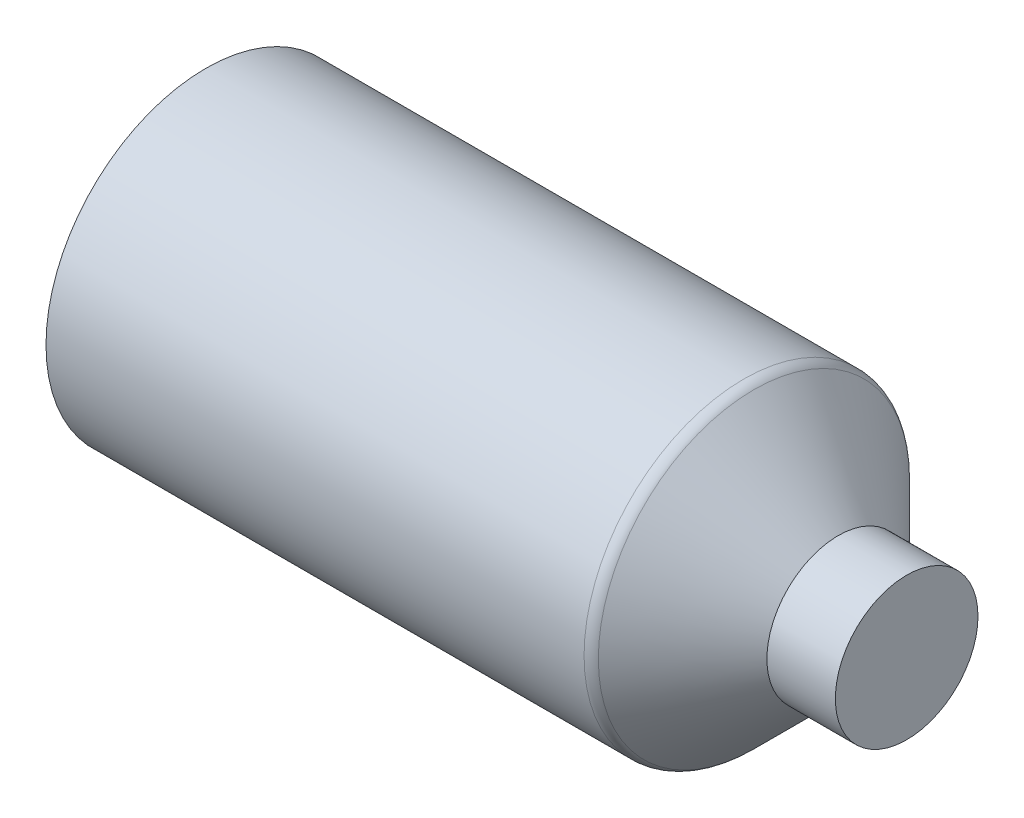
ISO-10303-21;
HEADER;
FILE_DESCRIPTION(('STEP AP214'),'2;1');
FILE_NAME('part.step','',(''),(''),'','','');
FILE_SCHEMA(('AUTOMOTIVE_DESIGN { 1 0 10303 214 1 1 1 1 }'));
ENDSEC;
DATA;
#1=APPLICATION_CONTEXT('core data for automotive mechanical design processes');
#2=APPLICATION_PROTOCOL_DEFINITION('international standard','automotive_design',2000,#1);
#3=PRODUCT_CONTEXT('',#1,'mechanical');
#4=PRODUCT('Part','Part','',(#3));
#5=PRODUCT_RELATED_PRODUCT_CATEGORY('part','',(#4));
#6=PRODUCT_DEFINITION_FORMATION('','',#4);
#7=PRODUCT_DEFINITION_CONTEXT('part definition',#1,'design');
#8=PRODUCT_DEFINITION('design','',#6,#7);
#9=PRODUCT_DEFINITION_SHAPE('','',#8);
#10=(LENGTH_UNIT() NAMED_UNIT(*) SI_UNIT(.MILLI.,.METRE.));
#11=(NAMED_UNIT(*) PLANE_ANGLE_UNIT() SI_UNIT($,.RADIAN.));
#12=(NAMED_UNIT(*) SI_UNIT($,.STERADIAN.) SOLID_ANGLE_UNIT());
#13=UNCERTAINTY_MEASURE_WITH_UNIT(LENGTH_MEASURE(1.E-05),#10,'distance_accuracy_value','');
#14=(GEOMETRIC_REPRESENTATION_CONTEXT(3) GLOBAL_UNCERTAINTY_ASSIGNED_CONTEXT((#13)) GLOBAL_UNIT_ASSIGNED_CONTEXT((#10,
#11,#12)) REPRESENTATION_CONTEXT('',''));
#15=CARTESIAN_POINT('',(0.,0.,0.));
#16=DIRECTION('',(0.,0.,1.));
#17=DIRECTION('',(1.,0.,0.));
#18=AXIS2_PLACEMENT_3D('',#15,#16,#17);
#19=CARTESIAN_POINT('',(24.17211464598,0.,0.));
#20=DIRECTION('',(1.,0.,0.));
#21=DIRECTION('',(0.,0.,-1.));
#22=AXIS2_PLACEMENT_3D('',#19,#20,#21);
#23=CYLINDRICAL_SURFACE('',#22,11.43);
#24=CARTESIAN_POINT('',(-15.6638730333181,0.,0.));
#25=DIRECTION('',(1.,0.,0.));
#26=DIRECTION('',(0.,0.,-1.));
#27=AXIS2_PLACEMENT_3D('',#24,#25,#26);
#28=CIRCLE('',#27,11.43);
#29=CARTESIAN_POINT('',(-15.6638730333181,0.,-11.43));
#30=VERTEX_POINT('',#29);
#31=EDGE_CURVE('E62',#30,#30,#28,.T.);
#32=ORIENTED_EDGE('',*,*,#31,.T.);
#33=EDGE_LOOP('',(#32));
#34=FACE_BOUND('',#33,.T.);
#35=CARTESIAN_POINT('',(-76.2,0.,0.));
#36=DIRECTION('',(1.,0.,0.));
#37=DIRECTION('',(0.,0.,-1.));
#38=AXIS2_PLACEMENT_3D('',#35,#36,#37);
#39=CIRCLE('',#38,11.43);
#40=CARTESIAN_POINT('',(-76.2,0.,-11.43));
#41=VERTEX_POINT('',#40);
#42=EDGE_CURVE('E10',#41,#41,#39,.T.);
#43=ORIENTED_EDGE('',*,*,#42,.F.);
#44=EDGE_LOOP('',(#43));
#45=FACE_BOUND('',#44,.T.);
#46=ADVANCED_FACE('F37',(#34,#45),#23,.F.);
#47=CARTESIAN_POINT('',(-76.2,17.78,0.));
#48=DIRECTION('',(-1.,0.,0.));
#49=DIRECTION('',(0.,0.,1.));
#50=AXIS2_PLACEMENT_3D('',#47,#48,#49);
#51=PLANE('',#50);
#52=ORIENTED_EDGE('',*,*,#42,.T.);
#53=EDGE_LOOP('',(#52));
#54=FACE_BOUND('',#53,.T.);
#55=CARTESIAN_POINT('',(-76.2,0.,0.));
#56=DIRECTION('',(1.,0.,0.));
#57=DIRECTION('',(0.,0.,-1.));
#58=AXIS2_PLACEMENT_3D('',#55,#56,#57);
#59=CIRCLE('',#58,17.78);
#60=CARTESIAN_POINT('',(-76.2,0.,-17.78));
#61=VERTEX_POINT('',#60);
#62=EDGE_CURVE('E43',#61,#61,#59,.T.);
#63=ORIENTED_EDGE('',*,*,#62,.F.);
#64=EDGE_LOOP('',(#63));
#65=FACE_BOUND('',#64,.T.);
#66=ADVANCED_FACE('F79',(#54,#65),#51,.T.);
#67=CARTESIAN_POINT('',(24.17211464598,0.,0.));
#68=DIRECTION('',(1.,0.,0.));
#69=DIRECTION('',(0.,0.,-1.));
#70=AXIS2_PLACEMENT_3D('',#67,#68,#69);
#71=CYLINDRICAL_SURFACE('',#70,17.78);
#72=ORIENTED_EDGE('',*,*,#62,.T.);
#73=EDGE_LOOP('',(#72));
#74=FACE_BOUND('',#73,.T.);
#75=CARTESIAN_POINT('',(-16.3214370635854,0.,0.));
#76=DIRECTION('',(1.,0.,0.));
#77=DIRECTION('',(0.,0.,-1.));
#78=AXIS2_PLACEMENT_3D('',#75,#76,#77);
#79=CIRCLE('',#78,17.78);
#80=CARTESIAN_POINT('',(-16.3214370635854,0.,-17.78));
#81=VERTEX_POINT('',#80);
#82=EDGE_CURVE('E47',#81,#81,#79,.T.);
#83=ORIENTED_EDGE('',*,*,#82,.F.);
#84=EDGE_LOOP('',(#83));
#85=FACE_BOUND('',#84,.T.);
#86=ADVANCED_FACE('F83',(#74,#85),#71,.T.);
#87=CARTESIAN_POINT('',(-16.3214370635854,0.,0.));
#88=DIRECTION('',(1.,0.,0.));
#89=DIRECTION('',(0.,0.,-1.));
#90=AXIS2_PLACEMENT_3D('',#87,#88,#89);
#91=TOROIDAL_SURFACE('',#90,16.1925,1.58749999999999);
#92=ORIENTED_EDGE('',*,*,#82,.T.);
#93=EDGE_LOOP('',(#92));
#94=FACE_BOUND('',#93,.T.);
#95=CARTESIAN_POINT('',(-15.1989050484517,0.,0.));
#96=DIRECTION('',(1.,0.,0.));
#97=DIRECTION('',(0.,0.,-1.));
#98=AXIS2_PLACEMENT_3D('',#95,#96,#97);
#99=CIRCLE('',#98,17.3150320151336);
#100=CARTESIAN_POINT('',(-15.1989050484517,0.,-17.3150320151336));
#101=VERTEX_POINT('',#100);
#102=EDGE_CURVE('E51',#101,#101,#99,.T.);
#103=ORIENTED_EDGE('',*,*,#102,.F.);
#104=EDGE_LOOP('',(#103));
#105=FACE_BOUND('',#104,.T.);
#106=ADVANCED_FACE('F87',(#94,#105),#91,.T.);
#107=CARTESIAN_POINT('',(-5.82137303331799,0.,0.));
#108=DIRECTION('',(-1.,0.,0.));
#109=DIRECTION('',(0.,0.,1.));
#110=AXIS2_PLACEMENT_3D('',#107,#108,#109);
#111=CONICAL_SURFACE('',#110,7.9375,0.785398163397442);
#112=ORIENTED_EDGE('',*,*,#102,.T.);
#113=EDGE_LOOP('',(#112));
#114=FACE_BOUND('',#113,.T.);
#115=CARTESIAN_POINT('',(-5.82137303331799,0.,0.));
#116=DIRECTION('',(1.,0.,0.));
#117=DIRECTION('',(0.,0.,-1.));
#118=AXIS2_PLACEMENT_3D('',#115,#116,#117);
#119=CIRCLE('',#118,7.9375);
#120=CARTESIAN_POINT('',(-5.82137303331799,0.,-7.9375));
#121=VERTEX_POINT('',#120);
#122=EDGE_CURVE('E56',#121,#121,#119,.T.);
#123=ORIENTED_EDGE('',*,*,#122,.F.);
#124=EDGE_LOOP('',(#123));
#125=FACE_BOUND('',#124,.T.);
#126=ADVANCED_FACE('F93',(#114,#125),#111,.T.);
#127=CARTESIAN_POINT('',(24.17211464598,0.,0.));
#128=DIRECTION('',(1.,0.,0.));
#129=DIRECTION('',(0.,0.,-1.));
#130=AXIS2_PLACEMENT_3D('',#127,#128,#129);
#131=CYLINDRICAL_SURFACE('',#130,7.9375);
#132=ORIENTED_EDGE('',*,*,#122,.T.);
#133=EDGE_LOOP('',(#132));
#134=FACE_BOUND('',#133,.T.);
#135=CARTESIAN_POINT('',(1.79862696668201,0.,0.));
#136=DIRECTION('',(1.,0.,0.));
#137=DIRECTION('',(0.,0.,-1.));
#138=AXIS2_PLACEMENT_3D('',#135,#136,#137);
#139=CIRCLE('',#138,7.9375);
#140=CARTESIAN_POINT('',(1.79862696668201,0.,-7.9375));
#141=VERTEX_POINT('',#140);
#142=EDGE_CURVE('E59',#141,#141,#139,.T.);
#143=ORIENTED_EDGE('',*,*,#142,.F.);
#144=EDGE_LOOP('',(#143));
#145=FACE_BOUND('',#144,.T.);
#146=ADVANCED_FACE('F75',(#134,#145),#131,.T.);
#147=CARTESIAN_POINT('',(1.79862696668201,7.9375,0.));
#148=DIRECTION('',(1.,0.,0.));
#149=DIRECTION('',(0.,0.,-1.));
#150=AXIS2_PLACEMENT_3D('',#147,#148,#149);
#151=PLANE('',#150);
#152=ORIENTED_EDGE('',*,*,#142,.T.);
#153=EDGE_LOOP('',(#152));
#154=FACE_BOUND('',#153,.T.);
#155=ADVANCED_FACE('F70',(#154),#151,.T.);
#156=CARTESIAN_POINT('',(-15.6638730333181,11.43,0.));
#157=DIRECTION('',(-1.,0.,0.));
#158=DIRECTION('',(0.,0.,1.));
#159=AXIS2_PLACEMENT_3D('',#156,#157,#158);
#160=PLANE('',#159);
#161=ORIENTED_EDGE('',*,*,#31,.F.);
#162=EDGE_LOOP('',(#161));
#163=FACE_BOUND('',#162,.T.);
#164=ADVANCED_FACE('F68',(#163),#160,.T.);
#165=CLOSED_SHELL('',(#46,#66,#86,#106,#126,#146,#155,#164));
#166=MANIFOLD_SOLID_BREP('B2',#165);
#167=ADVANCED_BREP_SHAPE_REPRESENTATION('',(#18,#166),#14);
#168=SHAPE_DEFINITION_REPRESENTATION(#9,#167);
ENDSEC;
END-ISO-10303-21;
